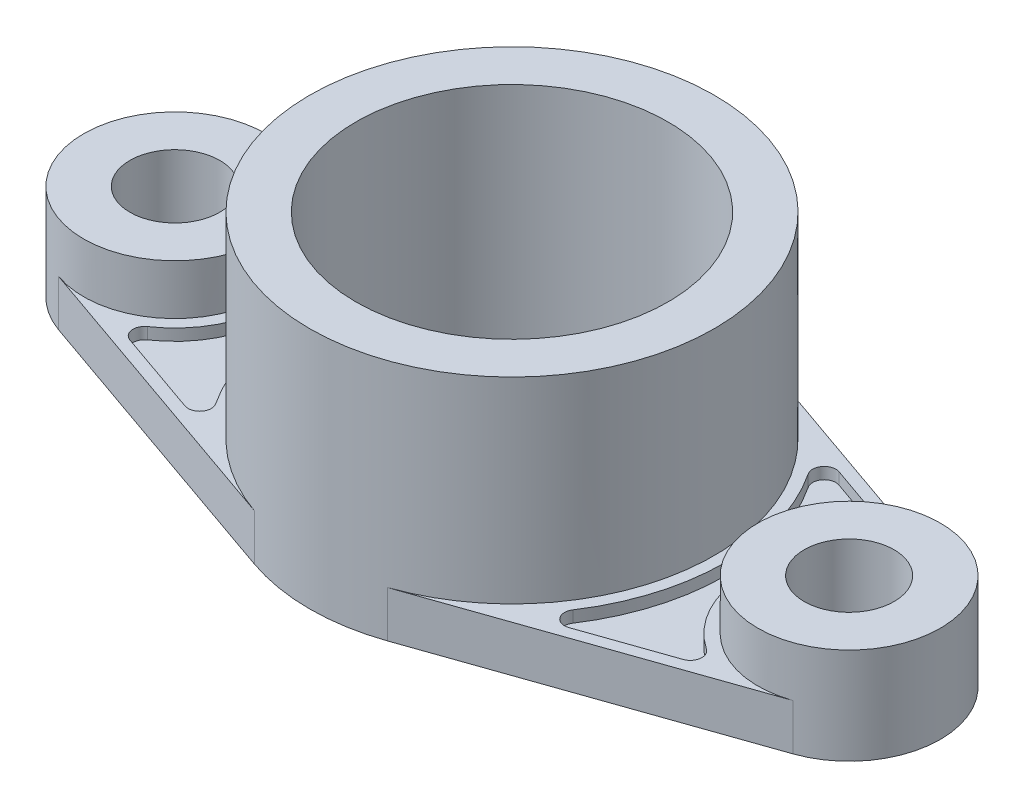
ISO-10303-21;
HEADER;
FILE_DESCRIPTION(('STEP AP214'),'2;1');
FILE_NAME('part.step','',(''),(''),'','','');
FILE_SCHEMA(('AUTOMOTIVE_DESIGN { 1 0 10303 214 1 1 1 1 }'));
ENDSEC;
DATA;
#1=APPLICATION_CONTEXT('core data for automotive mechanical design processes');
#2=APPLICATION_PROTOCOL_DEFINITION('international standard','automotive_design',2000,#1);
#3=PRODUCT_CONTEXT('',#1,'mechanical');
#4=PRODUCT('Part','Part','',(#3));
#5=PRODUCT_RELATED_PRODUCT_CATEGORY('part','',(#4));
#6=PRODUCT_DEFINITION_FORMATION('','',#4);
#7=PRODUCT_DEFINITION_CONTEXT('part definition',#1,'design');
#8=PRODUCT_DEFINITION('design','',#6,#7);
#9=PRODUCT_DEFINITION_SHAPE('','',#8);
#10=(LENGTH_UNIT() NAMED_UNIT(*) SI_UNIT(.MILLI.,.METRE.));
#11=(NAMED_UNIT(*) PLANE_ANGLE_UNIT() SI_UNIT($,.RADIAN.));
#12=(NAMED_UNIT(*) SI_UNIT($,.STERADIAN.) SOLID_ANGLE_UNIT());
#13=UNCERTAINTY_MEASURE_WITH_UNIT(LENGTH_MEASURE(1.E-05),#10,'distance_accuracy_value','');
#14=(GEOMETRIC_REPRESENTATION_CONTEXT(3) GLOBAL_UNCERTAINTY_ASSIGNED_CONTEXT((#13)) GLOBAL_UNIT_ASSIGNED_CONTEXT((#10,
#11,#12)) REPRESENTATION_CONTEXT('',''));
#15=CARTESIAN_POINT('',(0.,0.,0.));
#16=DIRECTION('',(0.,0.,1.));
#17=DIRECTION('',(1.,0.,0.));
#18=AXIS2_PLACEMENT_3D('',#15,#16,#17);
#19=CARTESIAN_POINT('',(-87.5,25.,0.));
#20=DIRECTION('',(0.,-1.,0.));
#21=DIRECTION('',(0.,0.,-1.));
#22=AXIS2_PLACEMENT_3D('',#19,#20,#21);
#23=CYLINDRICAL_SURFACE('',#22,23.665);
#24=CARTESIAN_POINT('',(-87.5,25.,0.));
#25=DIRECTION('',(0.,1.,0.));
#26=DIRECTION('',(0.,0.,1.));
#27=AXIS2_PLACEMENT_3D('',#24,#25,#26);
#28=CIRCLE('',#27,23.665);
#29=CARTESIAN_POINT('',(-87.5,25.,23.665));
#30=VERTEX_POINT('',#29);
#31=EDGE_CURVE('E11',#30,#30,#28,.T.);
#32=ORIENTED_EDGE('',*,*,#31,.F.);
#33=EDGE_LOOP('',(#32));
#34=FACE_BOUND('',#33,.T.);
#35=DIRECTION('',(0.,-1.,0.));
#36=VECTOR('',#35,1.);
#37=CARTESIAN_POINT('',(-95.2986317142857,12.,22.343087709288));
#38=LINE('',#37,#36);
#39=CARTESIAN_POINT('',(-95.2986317142857,12.,22.343087709288));
#40=VERTEX_POINT('',#39);
#41=CARTESIAN_POINT('',(-95.2986317142857,0.,22.343087709288));
#42=VERTEX_POINT('',#41);
#43=EDGE_CURVE('E487',#40,#42,#38,.T.);
#44=ORIENTED_EDGE('',*,*,#43,.F.);
#45=CARTESIAN_POINT('',(-87.5,12.,0.));
#46=DIRECTION('',(0.,1.,0.));
#47=DIRECTION('',(0.,0.,1.));
#48=AXIS2_PLACEMENT_3D('',#45,#46,#47);
#49=CIRCLE('',#48,23.665);
#50=CARTESIAN_POINT('',(-95.2986317142857,12.,-22.343087709288));
#51=VERTEX_POINT('',#50);
#52=EDGE_CURVE('E454',#40,#51,#49,.T.);
#53=ORIENTED_EDGE('',*,*,#52,.T.);
#54=DIRECTION('',(0.,-1.,0.));
#55=VECTOR('',#54,1.);
#56=CARTESIAN_POINT('',(-95.2986317142857,12.,-22.343087709288));
#57=LINE('',#56,#55);
#58=CARTESIAN_POINT('',(-95.2986317142857,0.,-22.343087709288));
#59=VERTEX_POINT('',#58);
#60=EDGE_CURVE('E470',#51,#59,#57,.T.);
#61=ORIENTED_EDGE('',*,*,#60,.T.);
#62=CARTESIAN_POINT('',(-87.5,0.,0.));
#63=DIRECTION('',(0.,1.,0.));
#64=DIRECTION('',(0.,0.,1.));
#65=AXIS2_PLACEMENT_3D('',#62,#63,#64);
#66=CIRCLE('',#65,23.665);
#67=EDGE_CURVE('E49',#59,#42,#66,.T.);
#68=ORIENTED_EDGE('',*,*,#67,.T.);
#69=EDGE_LOOP('',(#44,#53,#61,#68));
#70=FACE_BOUND('',#69,.T.);
#71=ADVANCED_FACE('F45',(#34,#70),#23,.T.);
#72=CARTESIAN_POINT('',(-87.5,25.,0.));
#73=DIRECTION('',(0.,-1.,0.));
#74=DIRECTION('',(0.,0.,-1.));
#75=AXIS2_PLACEMENT_3D('',#72,#73,#74);
#76=CYLINDRICAL_SURFACE('',#75,11.665);
#77=CARTESIAN_POINT('',(-87.5,25.,0.));
#78=DIRECTION('',(0.,1.,0.));
#79=DIRECTION('',(0.,0.,1.));
#80=AXIS2_PLACEMENT_3D('',#77,#78,#79);
#81=CIRCLE('',#80,11.665);
#82=CARTESIAN_POINT('',(-87.5,25.,11.665));
#83=VERTEX_POINT('',#82);
#84=EDGE_CURVE('E55',#83,#83,#81,.T.);
#85=ORIENTED_EDGE('',*,*,#84,.T.);
#86=EDGE_LOOP('',(#85));
#87=FACE_BOUND('',#86,.T.);
#88=CARTESIAN_POINT('',(-87.5,0.,0.));
#89=DIRECTION('',(0.,1.,0.));
#90=DIRECTION('',(0.,0.,1.));
#91=AXIS2_PLACEMENT_3D('',#88,#89,#90);
#92=CIRCLE('',#91,11.665);
#93=CARTESIAN_POINT('',(-87.5,0.,11.665));
#94=VERTEX_POINT('',#93);
#95=EDGE_CURVE('E491',#94,#94,#92,.T.);
#96=ORIENTED_EDGE('',*,*,#95,.F.);
#97=EDGE_LOOP('',(#96));
#98=FACE_BOUND('',#97,.T.);
#99=ADVANCED_FACE('F47',(#87,#98),#76,.F.);
#100=CARTESIAN_POINT('',(0.,25.,0.));
#101=DIRECTION('',(0.,1.,0.));
#102=DIRECTION('',(0.,0.,1.));
#103=AXIS2_PLACEMENT_3D('',#100,#101,#102);
#104=PLANE('',#103);
#105=ORIENTED_EDGE('',*,*,#84,.F.);
#106=EDGE_LOOP('',(#105));
#107=FACE_BOUND('',#106,.T.);
#108=ORIENTED_EDGE('',*,*,#31,.T.);
#109=EDGE_LOOP('',(#108));
#110=FACE_BOUND('',#109,.T.);
#111=ADVANCED_FACE('F556',(#107,#110),#104,.T.);
#112=CARTESIAN_POINT('',(0.,0.,0.));
#113=DIRECTION('',(0.,1.,0.));
#114=DIRECTION('',(0.,0.,1.));
#115=AXIS2_PLACEMENT_3D('',#112,#113,#114);
#116=PLANE('',#115);
#117=ORIENTED_EDGE('',*,*,#95,.T.);
#118=EDGE_LOOP('',(#117));
#119=FACE_BOUND('',#118,.T.);
#120=ORIENTED_EDGE('',*,*,#67,.F.);
#121=DIRECTION('',(0.944140617337334,0.,-0.329542857142857));
#122=VECTOR('',#121,1.);
#123=CARTESIAN_POINT('',(-17.301,0.,-49.5673824102101));
#124=LINE('',#123,#122);
#125=CARTESIAN_POINT('',(-17.301,0.,-49.5673824102101));
#126=VERTEX_POINT('',#125);
#127=EDGE_CURVE('E458',#59,#126,#124,.T.);
#128=ORIENTED_EDGE('',*,*,#127,.T.);
#129=CARTESIAN_POINT('',(0.,0.,0.));
#130=DIRECTION('',(0.,1.,0.));
#131=DIRECTION('',(0.,0.,1.));
#132=AXIS2_PLACEMENT_3D('',#129,#130,#131);
#133=CIRCLE('',#132,52.5);
#134=CARTESIAN_POINT('',(17.301,0.,-49.5673824102101));
#135=VERTEX_POINT('',#134);
#136=EDGE_CURVE('E450',#135,#126,#133,.T.);
#137=ORIENTED_EDGE('',*,*,#136,.F.);
#138=DIRECTION('',(-0.944140617337334,0.,-0.329542857142857));
#139=VECTOR('',#138,1.);
#140=CARTESIAN_POINT('',(17.301,0.,-49.5673824102101));
#141=LINE('',#140,#139);
#142=CARTESIAN_POINT('',(95.2986317142857,0.,-22.343087709288));
#143=VERTEX_POINT('',#142);
#144=EDGE_CURVE('E364',#143,#135,#141,.T.);
#145=ORIENTED_EDGE('',*,*,#144,.F.);
#146=CARTESIAN_POINT('',(87.5,0.,0.));
#147=DIRECTION('',(0.,1.,0.));
#148=DIRECTION('',(0.,0.,1.));
#149=AXIS2_PLACEMENT_3D('',#146,#147,#148);
#150=CIRCLE('',#149,23.665);
#151=CARTESIAN_POINT('',(95.2986317142857,0.,22.343087709288));
#152=VERTEX_POINT('',#151);
#153=EDGE_CURVE('E427',#152,#143,#150,.T.);
#154=ORIENTED_EDGE('',*,*,#153,.F.);
#155=DIRECTION('',(-0.944140617337334,0.,0.329542857142857));
#156=VECTOR('',#155,1.);
#157=CARTESIAN_POINT('',(17.301,0.,49.56738241021));
#158=LINE('',#157,#156);
#159=CARTESIAN_POINT('',(17.301,0.,49.56738241021));
#160=VERTEX_POINT('',#159);
#161=EDGE_CURVE('E389',#152,#160,#158,.T.);
#162=ORIENTED_EDGE('',*,*,#161,.T.);
#163=CARTESIAN_POINT('',(-17.301,0.,49.56738241021));
#164=VERTEX_POINT('',#163);
#165=EDGE_CURVE('E442',#164,#160,#133,.T.);
#166=ORIENTED_EDGE('',*,*,#165,.F.);
#167=DIRECTION('',(0.944140617337334,0.,0.329542857142857));
#168=VECTOR('',#167,1.);
#169=CARTESIAN_POINT('',(-17.301,0.,49.56738241021));
#170=LINE('',#169,#168);
#171=EDGE_CURVE('E446',#42,#164,#170,.T.);
#172=ORIENTED_EDGE('',*,*,#171,.F.);
#173=EDGE_LOOP('',(#120,#128,#137,#145,#154,#162,#166,#172));
#174=FACE_BOUND('',#173,.T.);
#175=CARTESIAN_POINT('',(0.,0.,0.));
#176=DIRECTION('',(0.,1.,0.));
#177=DIRECTION('',(0.,0.,1.));
#178=AXIS2_PLACEMENT_3D('',#175,#176,#177);
#179=CIRCLE('',#178,40.5);
#180=CARTESIAN_POINT('',(0.,0.,40.5));
#181=VERTEX_POINT('',#180);
#182=EDGE_CURVE('E431',#181,#181,#179,.T.);
#183=ORIENTED_EDGE('',*,*,#182,.T.);
#184=EDGE_LOOP('',(#183));
#185=FACE_BOUND('',#184,.T.);
#186=CARTESIAN_POINT('',(87.5,0.,0.));
#187=DIRECTION('',(0.,1.,0.));
#188=DIRECTION('',(0.,0.,1.));
#189=AXIS2_PLACEMENT_3D('',#186,#187,#188);
#190=CIRCLE('',#189,11.665);
#191=CARTESIAN_POINT('',(87.5,0.,11.665));
#192=VERTEX_POINT('',#191);
#193=EDGE_CURVE('E421',#192,#192,#190,.T.);
#194=ORIENTED_EDGE('',*,*,#193,.T.);
#195=EDGE_LOOP('',(#194));
#196=FACE_BOUND('',#195,.T.);
#197=ADVANCED_FACE('F509',(#119,#174,#185,#196),#116,.F.);
#198=CARTESIAN_POINT('',(-17.301,12.,49.56738241021));
#199=DIRECTION('',(0.329542857142857,0.,-0.944140617337334));
#200=DIRECTION('',(-0.944140617337334,0.,-0.329542857142857));
#201=AXIS2_PLACEMENT_3D('',#198,#199,#200);
#202=PLANE('',#201);
#203=ORIENTED_EDGE('',*,*,#171,.T.);
#204=DIRECTION('',(0.,-1.,0.));
#205=VECTOR('',#204,1.);
#206=CARTESIAN_POINT('',(-17.301,12.,49.56738241021));
#207=LINE('',#206,#205);
#208=CARTESIAN_POINT('',(-17.301,12.,49.56738241021));
#209=VERTEX_POINT('',#208);
#210=EDGE_CURVE('E483',#209,#164,#207,.T.);
#211=ORIENTED_EDGE('',*,*,#210,.F.);
#212=DIRECTION('',(0.944140617337334,0.,0.329542857142857));
#213=VECTOR('',#212,1.);
#214=CARTESIAN_POINT('',(-17.301,12.,49.56738241021));
#215=LINE('',#214,#213);
#216=EDGE_CURVE('E457',#40,#209,#215,.T.);
#217=ORIENTED_EDGE('',*,*,#216,.F.);
#218=ORIENTED_EDGE('',*,*,#43,.T.);
#219=EDGE_LOOP('',(#203,#211,#217,#218));
#220=FACE_BOUND('',#219,.T.);
#221=ADVANCED_FACE('F506',(#220),#202,.F.);
#222=CARTESIAN_POINT('',(-17.301,12.,-49.5673824102101));
#223=DIRECTION('',(-0.329542857142857,0.,-0.944140617337334));
#224=DIRECTION('',(-0.944140617337334,0.,0.329542857142857));
#225=AXIS2_PLACEMENT_3D('',#222,#223,#224);
#226=PLANE('',#225);
#227=ORIENTED_EDGE('',*,*,#127,.F.);
#228=ORIENTED_EDGE('',*,*,#60,.F.);
#229=DIRECTION('',(0.944140617337334,0.,-0.329542857142857));
#230=VECTOR('',#229,1.);
#231=CARTESIAN_POINT('',(-17.301,12.,-49.5673824102101));
#232=LINE('',#231,#230);
#233=CARTESIAN_POINT('',(-17.301,12.,-49.5673824102101));
#234=VERTEX_POINT('',#233);
#235=EDGE_CURVE('E466',#51,#234,#232,.T.);
#236=ORIENTED_EDGE('',*,*,#235,.T.);
#237=DIRECTION('',(0.,-1.,0.));
#238=VECTOR('',#237,1.);
#239=CARTESIAN_POINT('',(-17.301,12.,-49.5673824102101));
#240=LINE('',#239,#238);
#241=EDGE_CURVE('E479',#234,#126,#240,.T.);
#242=ORIENTED_EDGE('',*,*,#241,.T.);
#243=EDGE_LOOP('',(#227,#228,#236,#242));
#244=FACE_BOUND('',#243,.T.);
#245=ADVANCED_FACE('F521',(#244),#226,.T.);
#246=CARTESIAN_POINT('',(0.,12.,0.));
#247=DIRECTION('',(0.,1.,0.));
#248=DIRECTION('',(0.,0.,1.));
#249=AXIS2_PLACEMENT_3D('',#246,#247,#248);
#250=PLANE('',#249);
#251=CARTESIAN_POINT('',(-48.8374101689384,12.,-32.2049276973396));
#252=DIRECTION('',(0.,1.,0.));
#253=DIRECTION('',(0.,0.,1.));
#254=AXIS2_PLACEMENT_3D('',#251,#252,#253);
#255=CIRCLE('',#254,3.);
#256=CARTESIAN_POINT('',(-46.3329275961723,12.,-30.5533929436299));
#257=VERTEX_POINT('',#256);
#258=CARTESIAN_POINT('',(-49.826038740367,12.,-35.0373495493516));
#259=VERTEX_POINT('',#258);
#260=EDGE_CURVE('E71',#257,#259,#255,.T.);
#261=ORIENTED_EDGE('',*,*,#260,.F.);
#262=CARTESIAN_POINT('',(0.,12.,0.));
#263=DIRECTION('',(0.,1.,0.));
#264=DIRECTION('',(0.,0.,1.));
#265=AXIS2_PLACEMENT_3D('',#262,#263,#264);
#266=CIRCLE('',#265,55.5);
#267=CARTESIAN_POINT('',(-46.3329275961724,12.,30.5533929436298));
#268=VERTEX_POINT('',#267);
#269=EDGE_CURVE('E307',#257,#268,#266,.T.);
#270=ORIENTED_EDGE('',*,*,#269,.T.);
#271=CARTESIAN_POINT('',(-48.8374101689384,12.,32.2049276973396));
#272=DIRECTION('',(0.,1.,0.));
#273=DIRECTION('',(0.,0.,1.));
#274=AXIS2_PLACEMENT_3D('',#271,#272,#273);
#275=CIRCLE('',#274,3.);
#276=CARTESIAN_POINT('',(-49.826038740367,12.,35.0373495493516));
#277=VERTEX_POINT('',#276);
#278=EDGE_CURVE('E354',#277,#268,#275,.T.);
#279=ORIENTED_EDGE('',*,*,#278,.F.);
#280=DIRECTION('',(0.944140617337334,0.,0.329542857142857));
#281=VECTOR('',#280,1.);
#282=CARTESIAN_POINT('',(-71.8093276206941,12.,27.3643020244494));
#283=LINE('',#282,#281);
#284=CARTESIAN_POINT('',(-71.8093276206941,12.,27.3643020244494));
#285=VERTEX_POINT('',#284);
#286=EDGE_CURVE('E350',#285,#277,#283,.T.);
#287=ORIENTED_EDGE('',*,*,#286,.F.);
#288=CARTESIAN_POINT('',(-70.8206990492656,12.,24.5318801724374));
#289=DIRECTION('',(0.,-1.,0.));
#290=DIRECTION('',(0.,0.,-1.));
#291=AXIS2_PLACEMENT_3D('',#288,#289,#290);
#292=CIRCLE('',#291,3.);
#293=CARTESIAN_POINT('',(-72.507464694039,12.,22.0509888689717));
#294=VERTEX_POINT('',#293);
#295=EDGE_CURVE('E346',#285,#294,#292,.T.);
#296=ORIENTED_EDGE('',*,*,#295,.T.);
#297=CARTESIAN_POINT('',(-87.5,12.,0.));
#298=DIRECTION('',(0.,1.,0.));
#299=DIRECTION('',(0.,0.,1.));
#300=AXIS2_PLACEMENT_3D('',#297,#298,#299);
#301=CIRCLE('',#300,26.665);
#302=CARTESIAN_POINT('',(-72.507464694039,12.,-22.0509888689717));
#303=VERTEX_POINT('',#302);
#304=EDGE_CURVE('E342',#294,#303,#301,.T.);
#305=ORIENTED_EDGE('',*,*,#304,.T.);
#306=CARTESIAN_POINT('',(-70.8206990492656,12.,-24.5318801724374));
#307=DIRECTION('',(0.,-1.,0.));
#308=DIRECTION('',(0.,0.,-1.));
#309=AXIS2_PLACEMENT_3D('',#306,#307,#308);
#310=CIRCLE('',#309,3.);
#311=CARTESIAN_POINT('',(-71.8093276206941,12.,-27.3643020244494));
#312=VERTEX_POINT('',#311);
#313=EDGE_CURVE('E338',#303,#312,#310,.T.);
#314=ORIENTED_EDGE('',*,*,#313,.T.);
#315=DIRECTION('',(-0.944140617337334,0.,0.329542857142857));
#316=VECTOR('',#315,1.);
#317=CARTESIAN_POINT('',(-49.826038740367,12.,-35.0373495493516));
#318=LINE('',#317,#316);
#319=EDGE_CURVE('E334',#259,#312,#318,.T.);
#320=ORIENTED_EDGE('',*,*,#319,.F.);
#321=EDGE_LOOP('',(#261,#270,#279,#287,#296,#305,#314,#320));
#322=FACE_BOUND('',#321,.T.);
#323=ORIENTED_EDGE('',*,*,#52,.F.);
#324=ORIENTED_EDGE('',*,*,#216,.T.);
#325=CARTESIAN_POINT('',(0.,12.,0.));
#326=DIRECTION('',(0.,1.,0.));
#327=DIRECTION('',(0.,0.,1.));
#328=AXIS2_PLACEMENT_3D('',#325,#326,#327);
#329=CIRCLE('',#328,52.5);
#330=EDGE_CURVE('E462',#234,#209,#329,.T.);
#331=ORIENTED_EDGE('',*,*,#330,.F.);
#332=ORIENTED_EDGE('',*,*,#235,.F.);
#333=EDGE_LOOP('',(#323,#324,#331,#332));
#334=FACE_BOUND('',#333,.T.);
#335=ADVANCED_FACE('F518',(#322,#334),#250,.T.);
#336=CARTESIAN_POINT('',(0.,63.,0.));
#337=DIRECTION('',(0.,-1.,0.));
#338=DIRECTION('',(0.,0.,-1.));
#339=AXIS2_PLACEMENT_3D('',#336,#337,#338);
#340=CYLINDRICAL_SURFACE('',#339,40.5);
#341=CARTESIAN_POINT('',(0.,63.,0.));
#342=DIRECTION('',(0.,1.,0.));
#343=DIRECTION('',(0.,0.,1.));
#344=AXIS2_PLACEMENT_3D('',#341,#342,#343);
#345=CIRCLE('',#344,40.5);
#346=CARTESIAN_POINT('',(0.,63.,40.5));
#347=VERTEX_POINT('',#346);
#348=EDGE_CURVE('E437',#347,#347,#345,.T.);
#349=ORIENTED_EDGE('',*,*,#348,.T.);
#350=EDGE_LOOP('',(#349));
#351=FACE_BOUND('',#350,.T.);
#352=ORIENTED_EDGE('',*,*,#182,.F.);
#353=EDGE_LOOP('',(#352));
#354=FACE_BOUND('',#353,.T.);
#355=ADVANCED_FACE('F568',(#351,#354),#340,.F.);
#356=CARTESIAN_POINT('',(0.,63.,0.));
#357=DIRECTION('',(0.,-1.,0.));
#358=DIRECTION('',(0.,0.,-1.));
#359=AXIS2_PLACEMENT_3D('',#356,#357,#358);
#360=CYLINDRICAL_SURFACE('',#359,52.5);
#361=CARTESIAN_POINT('',(0.,12.,0.));
#362=DIRECTION('',(0.,1.,0.));
#363=DIRECTION('',(0.,0.,1.));
#364=AXIS2_PLACEMENT_3D('',#361,#362,#363);
#365=CIRCLE('',#364,52.5);
#366=CARTESIAN_POINT('',(17.301,12.,49.56738241021));
#367=VERTEX_POINT('',#366);
#368=CARTESIAN_POINT('',(17.301,12.,-49.5673824102101));
#369=VERTEX_POINT('',#368);
#370=EDGE_CURVE('E393',#367,#369,#365,.T.);
#371=ORIENTED_EDGE('',*,*,#370,.T.);
#372=DIRECTION('',(0.,-1.,0.));
#373=VECTOR('',#372,1.);
#374=CARTESIAN_POINT('',(17.301,12.,-49.5673824102101));
#375=LINE('',#374,#373);
#376=EDGE_CURVE('E413',#369,#135,#375,.T.);
#377=ORIENTED_EDGE('',*,*,#376,.T.);
#378=ORIENTED_EDGE('',*,*,#136,.T.);
#379=ORIENTED_EDGE('',*,*,#241,.F.);
#380=ORIENTED_EDGE('',*,*,#330,.T.);
#381=ORIENTED_EDGE('',*,*,#210,.T.);
#382=ORIENTED_EDGE('',*,*,#165,.T.);
#383=DIRECTION('',(0.,-1.,0.));
#384=VECTOR('',#383,1.);
#385=CARTESIAN_POINT('',(17.301,12.,49.56738241021));
#386=LINE('',#385,#384);
#387=EDGE_CURVE('E410',#367,#160,#386,.T.);
#388=ORIENTED_EDGE('',*,*,#387,.F.);
#389=EDGE_LOOP('',(#371,#377,#378,#379,#380,#381,#382,#388));
#390=FACE_BOUND('',#389,.T.);
#391=CARTESIAN_POINT('',(0.,63.,0.));
#392=DIRECTION('',(0.,1.,0.));
#393=DIRECTION('',(0.,0.,1.));
#394=AXIS2_PLACEMENT_3D('',#391,#392,#393);
#395=CIRCLE('',#394,52.5);
#396=CARTESIAN_POINT('',(0.,63.,52.5));
#397=VERTEX_POINT('',#396);
#398=EDGE_CURVE('E441',#397,#397,#395,.T.);
#399=ORIENTED_EDGE('',*,*,#398,.F.);
#400=EDGE_LOOP('',(#399));
#401=FACE_BOUND('',#400,.T.);
#402=ADVANCED_FACE('F514',(#390,#401),#360,.T.);
#403=CARTESIAN_POINT('',(0.,63.,0.));
#404=DIRECTION('',(0.,1.,0.));
#405=DIRECTION('',(0.,0.,1.));
#406=AXIS2_PLACEMENT_3D('',#403,#404,#405);
#407=PLANE('',#406);
#408=ORIENTED_EDGE('',*,*,#348,.F.);
#409=EDGE_LOOP('',(#408));
#410=FACE_BOUND('',#409,.T.);
#411=ORIENTED_EDGE('',*,*,#398,.T.);
#412=EDGE_LOOP('',(#411));
#413=FACE_BOUND('',#412,.T.);
#414=ADVANCED_FACE('F575',(#410,#413),#407,.T.);
#415=CARTESIAN_POINT('',(87.5,25.,0.));
#416=DIRECTION('',(0.,-1.,0.));
#417=DIRECTION('',(0.,0.,-1.));
#418=AXIS2_PLACEMENT_3D('',#415,#416,#417);
#419=CYLINDRICAL_SURFACE('',#418,23.665);
#420=CARTESIAN_POINT('',(87.5,25.,0.));
#421=DIRECTION('',(0.,1.,0.));
#422=DIRECTION('',(0.,0.,1.));
#423=AXIS2_PLACEMENT_3D('',#420,#421,#422);
#424=CIRCLE('',#423,23.665);
#425=CARTESIAN_POINT('',(87.5,25.,23.665));
#426=VERTEX_POINT('',#425);
#427=EDGE_CURVE('E426',#426,#426,#424,.T.);
#428=ORIENTED_EDGE('',*,*,#427,.F.);
#429=EDGE_LOOP('',(#428));
#430=FACE_BOUND('',#429,.T.);
#431=DIRECTION('',(0.,-1.,0.));
#432=VECTOR('',#431,1.);
#433=CARTESIAN_POINT('',(95.2986317142857,12.,-22.343087709288));
#434=LINE('',#433,#432);
#435=CARTESIAN_POINT('',(95.2986317142857,12.,-22.343087709288));
#436=VERTEX_POINT('',#435);
#437=EDGE_CURVE('E417',#436,#143,#434,.T.);
#438=ORIENTED_EDGE('',*,*,#437,.F.);
#439=CARTESIAN_POINT('',(87.5,12.,0.));
#440=DIRECTION('',(0.,1.,0.));
#441=DIRECTION('',(0.,0.,1.));
#442=AXIS2_PLACEMENT_3D('',#439,#440,#441);
#443=CIRCLE('',#442,23.665);
#444=CARTESIAN_POINT('',(95.2986317142857,12.,22.343087709288));
#445=VERTEX_POINT('',#444);
#446=EDGE_CURVE('E385',#436,#445,#443,.T.);
#447=ORIENTED_EDGE('',*,*,#446,.T.);
#448=DIRECTION('',(0.,-1.,0.));
#449=VECTOR('',#448,1.);
#450=CARTESIAN_POINT('',(95.2986317142857,12.,22.343087709288));
#451=LINE('',#450,#449);
#452=EDGE_CURVE('E401',#445,#152,#451,.T.);
#453=ORIENTED_EDGE('',*,*,#452,.T.);
#454=ORIENTED_EDGE('',*,*,#153,.T.);
#455=EDGE_LOOP('',(#438,#447,#453,#454));
#456=FACE_BOUND('',#455,.T.);
#457=ADVANCED_FACE('F534',(#430,#456),#419,.T.);
#458=CARTESIAN_POINT('',(87.5,25.,0.));
#459=DIRECTION('',(0.,-1.,0.));
#460=DIRECTION('',(0.,0.,-1.));
#461=AXIS2_PLACEMENT_3D('',#458,#459,#460);
#462=CYLINDRICAL_SURFACE('',#461,11.665);
#463=CARTESIAN_POINT('',(87.5,25.,0.));
#464=DIRECTION('',(0.,1.,0.));
#465=DIRECTION('',(0.,0.,1.));
#466=AXIS2_PLACEMENT_3D('',#463,#464,#465);
#467=CIRCLE('',#466,11.665);
#468=CARTESIAN_POINT('',(87.5,25.,11.665));
#469=VERTEX_POINT('',#468);
#470=EDGE_CURVE('E422',#469,#469,#467,.T.);
#471=ORIENTED_EDGE('',*,*,#470,.T.);
#472=EDGE_LOOP('',(#471));
#473=FACE_BOUND('',#472,.T.);
#474=ORIENTED_EDGE('',*,*,#193,.F.);
#475=EDGE_LOOP('',(#474));
#476=FACE_BOUND('',#475,.T.);
#477=ADVANCED_FACE('F579',(#473,#476),#462,.F.);
#478=CARTESIAN_POINT('',(0.,25.,0.));
#479=DIRECTION('',(0.,1.,0.));
#480=DIRECTION('',(0.,0.,1.));
#481=AXIS2_PLACEMENT_3D('',#478,#479,#480);
#482=PLANE('',#481);
#483=ORIENTED_EDGE('',*,*,#470,.F.);
#484=EDGE_LOOP('',(#483));
#485=FACE_BOUND('',#484,.T.);
#486=ORIENTED_EDGE('',*,*,#427,.T.);
#487=EDGE_LOOP('',(#486));
#488=FACE_BOUND('',#487,.T.);
#489=ADVANCED_FACE('F547',(#485,#488),#482,.T.);
#490=CARTESIAN_POINT('',(17.301,12.,-49.5673824102101));
#491=DIRECTION('',(-0.329542857142857,0.,0.944140617337334));
#492=DIRECTION('',(0.944140617337334,0.,0.329542857142857));
#493=AXIS2_PLACEMENT_3D('',#490,#491,#492);
#494=PLANE('',#493);
#495=ORIENTED_EDGE('',*,*,#144,.T.);
#496=ORIENTED_EDGE('',*,*,#376,.F.);
#497=DIRECTION('',(-0.944140617337334,0.,-0.329542857142857));
#498=VECTOR('',#497,1.);
#499=CARTESIAN_POINT('',(17.301,12.,-49.5673824102101));
#500=LINE('',#499,#498);
#501=EDGE_CURVE('E388',#436,#369,#500,.T.);
#502=ORIENTED_EDGE('',*,*,#501,.F.);
#503=ORIENTED_EDGE('',*,*,#437,.T.);
#504=EDGE_LOOP('',(#495,#496,#502,#503));
#505=FACE_BOUND('',#504,.T.);
#506=ADVANCED_FACE('F527',(#505),#494,.F.);
#507=CARTESIAN_POINT('',(17.301,12.,49.56738241021));
#508=DIRECTION('',(0.329542857142857,0.,0.944140617337334));
#509=DIRECTION('',(0.944140617337334,0.,-0.329542857142857));
#510=AXIS2_PLACEMENT_3D('',#507,#508,#509);
#511=PLANE('',#510);
#512=ORIENTED_EDGE('',*,*,#161,.F.);
#513=ORIENTED_EDGE('',*,*,#452,.F.);
#514=DIRECTION('',(-0.944140617337334,0.,0.329542857142857));
#515=VECTOR('',#514,1.);
#516=CARTESIAN_POINT('',(17.301,12.,49.56738241021));
#517=LINE('',#516,#515);
#518=EDGE_CURVE('E397',#445,#367,#517,.T.);
#519=ORIENTED_EDGE('',*,*,#518,.T.);
#520=ORIENTED_EDGE('',*,*,#387,.T.);
#521=EDGE_LOOP('',(#512,#513,#519,#520));
#522=FACE_BOUND('',#521,.T.);
#523=ADVANCED_FACE('F536',(#522),#511,.T.);
#524=CARTESIAN_POINT('',(0.,12.,0.));
#525=DIRECTION('',(0.,1.,0.));
#526=DIRECTION('',(0.,0.,1.));
#527=AXIS2_PLACEMENT_3D('',#524,#525,#526);
#528=PLANE('',#527);
#529=CARTESIAN_POINT('',(0.,12.,0.));
#530=DIRECTION('',(0.,-1.,0.));
#531=DIRECTION('',(0.,0.,1.));
#532=AXIS2_PLACEMENT_3D('',#529,#530,#531);
#533=CIRCLE('',#532,55.5);
#534=CARTESIAN_POINT('',(46.3329275961723,12.,-30.5533929436299));
#535=VERTEX_POINT('',#534);
#536=CARTESIAN_POINT('',(46.3329275961724,12.,30.5533929436298));
#537=VERTEX_POINT('',#536);
#538=EDGE_CURVE('E256',#535,#537,#533,.T.);
#539=ORIENTED_EDGE('',*,*,#538,.F.);
#540=CARTESIAN_POINT('',(48.8374101689384,12.,-32.2049276973396));
#541=DIRECTION('',(0.,-1.,0.));
#542=DIRECTION('',(0.,0.,1.));
#543=AXIS2_PLACEMENT_3D('',#540,#541,#542);
#544=CIRCLE('',#543,3.);
#545=CARTESIAN_POINT('',(49.826038740367,12.,-35.0373495493516));
#546=VERTEX_POINT('',#545);
#547=EDGE_CURVE('E63',#535,#546,#544,.T.);
#548=ORIENTED_EDGE('',*,*,#547,.T.);
#549=DIRECTION('',(0.944140617337334,0.,0.329542857142857));
#550=VECTOR('',#549,1.);
#551=CARTESIAN_POINT('',(49.826038740367,12.,-35.0373495493516));
#552=LINE('',#551,#550);
#553=CARTESIAN_POINT('',(71.8093276206941,12.,-27.3643020244494));
#554=VERTEX_POINT('',#553);
#555=EDGE_CURVE('E228',#546,#554,#552,.T.);
#556=ORIENTED_EDGE('',*,*,#555,.T.);
#557=CARTESIAN_POINT('',(70.8206990492656,12.,-24.5318801724374));
#558=DIRECTION('',(0.,1.,0.));
#559=DIRECTION('',(0.,0.,-1.));
#560=AXIS2_PLACEMENT_3D('',#557,#558,#559);
#561=CIRCLE('',#560,3.);
#562=CARTESIAN_POINT('',(72.507464694039,12.,-22.0509888689717));
#563=VERTEX_POINT('',#562);
#564=EDGE_CURVE('E275',#563,#554,#561,.T.);
#565=ORIENTED_EDGE('',*,*,#564,.F.);
#566=CARTESIAN_POINT('',(87.5,12.,0.));
#567=DIRECTION('',(0.,-1.,0.));
#568=DIRECTION('',(0.,0.,1.));
#569=AXIS2_PLACEMENT_3D('',#566,#567,#568);
#570=CIRCLE('',#569,26.665);
#571=CARTESIAN_POINT('',(72.507464694039,12.,22.0509888689717));
#572=VERTEX_POINT('',#571);
#573=EDGE_CURVE('E271',#572,#563,#570,.T.);
#574=ORIENTED_EDGE('',*,*,#573,.F.);
#575=CARTESIAN_POINT('',(70.8206990492656,12.,24.5318801724374));
#576=DIRECTION('',(0.,1.,0.));
#577=DIRECTION('',(0.,0.,-1.));
#578=AXIS2_PLACEMENT_3D('',#575,#576,#577);
#579=CIRCLE('',#578,3.);
#580=CARTESIAN_POINT('',(71.8093276206941,12.,27.3643020244494));
#581=VERTEX_POINT('',#580);
#582=EDGE_CURVE('E267',#581,#572,#579,.T.);
#583=ORIENTED_EDGE('',*,*,#582,.F.);
#584=DIRECTION('',(-0.944140617337334,0.,0.329542857142857));
#585=VECTOR('',#584,1.);
#586=CARTESIAN_POINT('',(71.8093276206941,12.,27.3643020244494));
#587=LINE('',#586,#585);
#588=CARTESIAN_POINT('',(49.826038740367,12.,35.0373495493516));
#589=VERTEX_POINT('',#588);
#590=EDGE_CURVE('E263',#581,#589,#587,.T.);
#591=ORIENTED_EDGE('',*,*,#590,.T.);
#592=CARTESIAN_POINT('',(48.8374101689384,12.,32.2049276973396));
#593=DIRECTION('',(0.,-1.,0.));
#594=DIRECTION('',(0.,0.,1.));
#595=AXIS2_PLACEMENT_3D('',#592,#593,#594);
#596=CIRCLE('',#595,3.);
#597=EDGE_CURVE('E259',#589,#537,#596,.T.);
#598=ORIENTED_EDGE('',*,*,#597,.T.);
#599=EDGE_LOOP('',(#539,#548,#556,#565,#574,#583,#591,#598));
#600=FACE_BOUND('',#599,.T.);
#601=ORIENTED_EDGE('',*,*,#446,.F.);
#602=ORIENTED_EDGE('',*,*,#501,.T.);
#603=ORIENTED_EDGE('',*,*,#370,.F.);
#604=ORIENTED_EDGE('',*,*,#518,.F.);
#605=EDGE_LOOP('',(#601,#602,#603,#604));
#606=FACE_BOUND('',#605,.T.);
#607=ADVANCED_FACE('F530',(#600,#606),#528,.T.);
#608=CARTESIAN_POINT('',(-48.8374101689384,9.,-32.2049276973396));
#609=DIRECTION('',(0.,1.,0.));
#610=DIRECTION('',(0.,0.,1.));
#611=AXIS2_PLACEMENT_3D('',#608,#609,#610);
#612=CYLINDRICAL_SURFACE('',#611,3.);
#613=ORIENTED_EDGE('',*,*,#260,.T.);
#614=DIRECTION('',(0.,1.,0.));
#615=VECTOR('',#614,1.);
#616=CARTESIAN_POINT('',(-49.826038740367,9.,-35.0373495493516));
#617=LINE('',#616,#615);
#618=CARTESIAN_POINT('',(-49.826038740367,9.,-35.0373495493516));
#619=VERTEX_POINT('',#618);
#620=EDGE_CURVE('E331',#619,#259,#617,.T.);
#621=ORIENTED_EDGE('',*,*,#620,.F.);
#622=CARTESIAN_POINT('',(-48.8374101689384,9.,-32.2049276973396));
#623=DIRECTION('',(0.,1.,0.));
#624=DIRECTION('',(0.,0.,1.));
#625=AXIS2_PLACEMENT_3D('',#622,#623,#624);
#626=CIRCLE('',#625,3.);
#627=CARTESIAN_POINT('',(-46.3329275961723,9.,-30.5533929436299));
#628=VERTEX_POINT('',#627);
#629=EDGE_CURVE('E302',#628,#619,#626,.T.);
#630=ORIENTED_EDGE('',*,*,#629,.F.);
#631=DIRECTION('',(0.,1.,0.));
#632=VECTOR('',#631,1.);
#633=CARTESIAN_POINT('',(-46.3329275961723,9.,-30.5533929436299));
#634=LINE('',#633,#632);
#635=EDGE_CURVE('E361',#628,#257,#634,.T.);
#636=ORIENTED_EDGE('',*,*,#635,.T.);
#637=EDGE_LOOP('',(#613,#621,#630,#636));
#638=FACE_BOUND('',#637,.T.);
#639=ADVANCED_FACE('F544',(#638),#612,.F.);
#640=CARTESIAN_POINT('',(0.,9.,0.));
#641=DIRECTION('',(0.,1.,0.));
#642=DIRECTION('',(0.,0.,1.));
#643=AXIS2_PLACEMENT_3D('',#640,#641,#642);
#644=CYLINDRICAL_SURFACE('',#643,55.5);
#645=ORIENTED_EDGE('',*,*,#269,.F.);
#646=ORIENTED_EDGE('',*,*,#635,.F.);
#647=CARTESIAN_POINT('',(0.,9.,0.));
#648=DIRECTION('',(0.,1.,0.));
#649=DIRECTION('',(0.,0.,1.));
#650=AXIS2_PLACEMENT_3D('',#647,#648,#649);
#651=CIRCLE('',#650,55.5);
#652=CARTESIAN_POINT('',(-46.3329275961724,9.,30.5533929436298));
#653=VERTEX_POINT('',#652);
#654=EDGE_CURVE('E328',#628,#653,#651,.T.);
#655=ORIENTED_EDGE('',*,*,#654,.T.);
#656=DIRECTION('',(0.,1.,0.));
#657=VECTOR('',#656,1.);
#658=CARTESIAN_POINT('',(-46.3329275961724,9.,30.5533929436298));
#659=LINE('',#658,#657);
#660=EDGE_CURVE('E365',#653,#268,#659,.T.);
#661=ORIENTED_EDGE('',*,*,#660,.T.);
#662=EDGE_LOOP('',(#645,#646,#655,#661));
#663=FACE_BOUND('',#662,.T.);
#664=ADVANCED_FACE('F640',(#663),#644,.T.);
#665=CARTESIAN_POINT('',(-48.8374101689384,9.,32.2049276973396));
#666=DIRECTION('',(0.,1.,0.));
#667=DIRECTION('',(0.,0.,1.));
#668=AXIS2_PLACEMENT_3D('',#665,#666,#667);
#669=CYLINDRICAL_SURFACE('',#668,3.);
#670=ORIENTED_EDGE('',*,*,#278,.T.);
#671=ORIENTED_EDGE('',*,*,#660,.F.);
#672=CARTESIAN_POINT('',(-48.8374101689384,9.,32.2049276973396));
#673=DIRECTION('',(0.,1.,0.));
#674=DIRECTION('',(0.,0.,1.));
#675=AXIS2_PLACEMENT_3D('',#672,#673,#674);
#676=CIRCLE('',#675,3.);
#677=CARTESIAN_POINT('',(-49.826038740367,9.,35.0373495493516));
#678=VERTEX_POINT('',#677);
#679=EDGE_CURVE('E324',#678,#653,#676,.T.);
#680=ORIENTED_EDGE('',*,*,#679,.F.);
#681=DIRECTION('',(0.,1.,0.));
#682=VECTOR('',#681,1.);
#683=CARTESIAN_POINT('',(-49.826038740367,9.,35.0373495493516));
#684=LINE('',#683,#682);
#685=EDGE_CURVE('E368',#678,#277,#684,.T.);
#686=ORIENTED_EDGE('',*,*,#685,.T.);
#687=EDGE_LOOP('',(#670,#671,#680,#686));
#688=FACE_BOUND('',#687,.T.);
#689=ADVANCED_FACE('F648',(#688),#669,.F.);
#690=CARTESIAN_POINT('',(-71.8093276206941,9.,27.3643020244494));
#691=DIRECTION('',(-0.329542857142857,0.,0.944140617337334));
#692=DIRECTION('',(0.944140617337334,0.,0.329542857142857));
#693=AXIS2_PLACEMENT_3D('',#690,#691,#692);
#694=PLANE('',#693);
#695=ORIENTED_EDGE('',*,*,#286,.T.);
#696=ORIENTED_EDGE('',*,*,#685,.F.);
#697=DIRECTION('',(0.944140617337334,0.,0.329542857142857));
#698=VECTOR('',#697,1.);
#699=CARTESIAN_POINT('',(-71.8093276206941,9.,27.3643020244494));
#700=LINE('',#699,#698);
#701=CARTESIAN_POINT('',(-71.8093276206941,9.,27.3643020244494));
#702=VERTEX_POINT('',#701);
#703=EDGE_CURVE('E320',#702,#678,#700,.T.);
#704=ORIENTED_EDGE('',*,*,#703,.F.);
#705=DIRECTION('',(0.,1.,0.));
#706=VECTOR('',#705,1.);
#707=CARTESIAN_POINT('',(-71.8093276206941,9.,27.3643020244494));
#708=LINE('',#707,#706);
#709=EDGE_CURVE('E371',#702,#285,#708,.T.);
#710=ORIENTED_EDGE('',*,*,#709,.T.);
#711=EDGE_LOOP('',(#695,#696,#704,#710));
#712=FACE_BOUND('',#711,.T.);
#713=ADVANCED_FACE('F657',(#712),#694,.F.);
#714=CARTESIAN_POINT('',(-70.8206990492656,9.,24.5318801724374));
#715=DIRECTION('',(0.,1.,0.));
#716=DIRECTION('',(0.,0.,1.));
#717=AXIS2_PLACEMENT_3D('',#714,#715,#716);
#718=CYLINDRICAL_SURFACE('',#717,3.);
#719=ORIENTED_EDGE('',*,*,#295,.F.);
#720=ORIENTED_EDGE('',*,*,#709,.F.);
#721=CARTESIAN_POINT('',(-70.8206990492656,9.,24.5318801724374));
#722=DIRECTION('',(0.,-1.,0.));
#723=DIRECTION('',(0.,0.,-1.));
#724=AXIS2_PLACEMENT_3D('',#721,#722,#723);
#725=CIRCLE('',#724,3.);
#726=CARTESIAN_POINT('',(-72.507464694039,9.,22.0509888689717));
#727=VERTEX_POINT('',#726);
#728=EDGE_CURVE('E317',#702,#727,#725,.T.);
#729=ORIENTED_EDGE('',*,*,#728,.T.);
#730=DIRECTION('',(0.,1.,0.));
#731=VECTOR('',#730,1.);
#732=CARTESIAN_POINT('',(-72.507464694039,9.,22.0509888689717));
#733=LINE('',#732,#731);
#734=EDGE_CURVE('E374',#727,#294,#733,.T.);
#735=ORIENTED_EDGE('',*,*,#734,.T.);
#736=EDGE_LOOP('',(#719,#720,#729,#735));
#737=FACE_BOUND('',#736,.T.);
#738=ADVANCED_FACE('F666',(#737),#718,.F.);
#739=CARTESIAN_POINT('',(-87.5,9.,0.));
#740=DIRECTION('',(0.,1.,0.));
#741=DIRECTION('',(0.,0.,1.));
#742=AXIS2_PLACEMENT_3D('',#739,#740,#741);
#743=CYLINDRICAL_SURFACE('',#742,26.665);
#744=ORIENTED_EDGE('',*,*,#304,.F.);
#745=ORIENTED_EDGE('',*,*,#734,.F.);
#746=CARTESIAN_POINT('',(-87.5,9.,0.));
#747=DIRECTION('',(0.,1.,0.));
#748=DIRECTION('',(0.,0.,1.));
#749=AXIS2_PLACEMENT_3D('',#746,#747,#748);
#750=CIRCLE('',#749,26.665);
#751=CARTESIAN_POINT('',(-72.507464694039,9.,-22.0509888689717));
#752=VERTEX_POINT('',#751);
#753=EDGE_CURVE('E314',#727,#752,#750,.T.);
#754=ORIENTED_EDGE('',*,*,#753,.T.);
#755=DIRECTION('',(0.,1.,0.));
#756=VECTOR('',#755,1.);
#757=CARTESIAN_POINT('',(-72.507464694039,9.,-22.0509888689717));
#758=LINE('',#757,#756);
#759=EDGE_CURVE('E377',#752,#303,#758,.T.);
#760=ORIENTED_EDGE('',*,*,#759,.T.);
#761=EDGE_LOOP('',(#744,#745,#754,#760));
#762=FACE_BOUND('',#761,.T.);
#763=ADVANCED_FACE('F675',(#762),#743,.T.);
#764=CARTESIAN_POINT('',(-70.8206990492656,9.,-24.5318801724374));
#765=DIRECTION('',(0.,1.,0.));
#766=DIRECTION('',(0.,0.,1.));
#767=AXIS2_PLACEMENT_3D('',#764,#765,#766);
#768=CYLINDRICAL_SURFACE('',#767,3.);
#769=ORIENTED_EDGE('',*,*,#313,.F.);
#770=ORIENTED_EDGE('',*,*,#759,.F.);
#771=CARTESIAN_POINT('',(-70.8206990492656,9.,-24.5318801724374));
#772=DIRECTION('',(0.,-1.,0.));
#773=DIRECTION('',(0.,0.,-1.));
#774=AXIS2_PLACEMENT_3D('',#771,#772,#773);
#775=CIRCLE('',#774,3.);
#776=CARTESIAN_POINT('',(-71.8093276206941,9.,-27.3643020244494));
#777=VERTEX_POINT('',#776);
#778=EDGE_CURVE('E311',#752,#777,#775,.T.);
#779=ORIENTED_EDGE('',*,*,#778,.T.);
#780=DIRECTION('',(0.,1.,0.));
#781=VECTOR('',#780,1.);
#782=CARTESIAN_POINT('',(-71.8093276206941,9.,-27.3643020244494));
#783=LINE('',#782,#781);
#784=EDGE_CURVE('E380',#777,#312,#783,.T.);
#785=ORIENTED_EDGE('',*,*,#784,.T.);
#786=EDGE_LOOP('',(#769,#770,#779,#785));
#787=FACE_BOUND('',#786,.T.);
#788=ADVANCED_FACE('F684',(#787),#768,.F.);
#789=CARTESIAN_POINT('',(-49.826038740367,9.,-35.0373495493516));
#790=DIRECTION('',(-0.329542857142857,0.,-0.944140617337334));
#791=DIRECTION('',(-0.944140617337334,0.,0.329542857142857));
#792=AXIS2_PLACEMENT_3D('',#789,#790,#791);
#793=PLANE('',#792);
#794=ORIENTED_EDGE('',*,*,#319,.T.);
#795=ORIENTED_EDGE('',*,*,#784,.F.);
#796=DIRECTION('',(-0.944140617337334,0.,0.329542857142857));
#797=VECTOR('',#796,1.);
#798=CARTESIAN_POINT('',(-49.826038740367,9.,-35.0373495493516));
#799=LINE('',#798,#797);
#800=EDGE_CURVE('E306',#619,#777,#799,.T.);
#801=ORIENTED_EDGE('',*,*,#800,.F.);
#802=ORIENTED_EDGE('',*,*,#620,.T.);
#803=EDGE_LOOP('',(#794,#795,#801,#802));
#804=FACE_BOUND('',#803,.T.);
#805=ADVANCED_FACE('F693',(#804),#793,.F.);
#806=CARTESIAN_POINT('',(-48.8374101689384,9.,-32.2049276973396));
#807=DIRECTION('',(0.,1.,0.));
#808=DIRECTION('',(0.,0.,1.));
#809=AXIS2_PLACEMENT_3D('',#806,#807,#808);
#810=PLANE('',#809);
#811=ORIENTED_EDGE('',*,*,#629,.T.);
#812=ORIENTED_EDGE('',*,*,#800,.T.);
#813=ORIENTED_EDGE('',*,*,#778,.F.);
#814=ORIENTED_EDGE('',*,*,#753,.F.);
#815=ORIENTED_EDGE('',*,*,#728,.F.);
#816=ORIENTED_EDGE('',*,*,#703,.T.);
#817=ORIENTED_EDGE('',*,*,#679,.T.);
#818=ORIENTED_EDGE('',*,*,#654,.F.);
#819=EDGE_LOOP('',(#811,#812,#813,#814,#815,#816,#817,#818));
#820=FACE_BOUND('',#819,.T.);
#821=ADVANCED_FACE('F702',(#820),#810,.T.);
#822=CARTESIAN_POINT('',(48.8374101689384,9.,-32.2049276973396));
#823=DIRECTION('',(0.,1.,0.));
#824=DIRECTION('',(0.,0.,1.));
#825=AXIS2_PLACEMENT_3D('',#822,#823,#824);
#826=CYLINDRICAL_SURFACE('',#825,3.);
#827=ORIENTED_EDGE('',*,*,#547,.F.);
#828=DIRECTION('',(0.,1.,0.));
#829=VECTOR('',#828,1.);
#830=CARTESIAN_POINT('',(46.3329275961723,9.,-30.5533929436299));
#831=LINE('',#830,#829);
#832=CARTESIAN_POINT('',(46.3329275961723,9.,-30.5533929436299));
#833=VERTEX_POINT('',#832);
#834=EDGE_CURVE('E208',#833,#535,#831,.T.);
#835=ORIENTED_EDGE('',*,*,#834,.F.);
#836=CARTESIAN_POINT('',(48.8374101689384,9.,-32.2049276973396));
#837=DIRECTION('',(0.,-1.,0.));
#838=DIRECTION('',(0.,0.,1.));
#839=AXIS2_PLACEMENT_3D('',#836,#837,#838);
#840=CIRCLE('',#839,3.);
#841=CARTESIAN_POINT('',(49.826038740367,9.,-35.0373495493516));
#842=VERTEX_POINT('',#841);
#843=EDGE_CURVE('E211',#833,#842,#840,.T.);
#844=ORIENTED_EDGE('',*,*,#843,.T.);
#845=DIRECTION('',(0.,1.,0.));
#846=VECTOR('',#845,1.);
#847=CARTESIAN_POINT('',(49.826038740367,9.,-35.0373495493516));
#848=LINE('',#847,#846);
#849=EDGE_CURVE('E282',#842,#546,#848,.T.);
#850=ORIENTED_EDGE('',*,*,#849,.T.);
#851=EDGE_LOOP('',(#827,#835,#844,#850));
#852=FACE_BOUND('',#851,.T.);
#853=ADVANCED_FACE('F210',(#852),#826,.F.);
#854=CARTESIAN_POINT('',(49.826038740367,9.,-35.0373495493516));
#855=DIRECTION('',(-0.329542857142857,0.,0.944140617337334));
#856=DIRECTION('',(0.944140617337334,0.,0.329542857142857));
#857=AXIS2_PLACEMENT_3D('',#854,#855,#856);
#858=PLANE('',#857);
#859=ORIENTED_EDGE('',*,*,#555,.F.);
#860=ORIENTED_EDGE('',*,*,#849,.F.);
#861=DIRECTION('',(0.944140617337334,0.,0.329542857142857));
#862=VECTOR('',#861,1.);
#863=CARTESIAN_POINT('',(49.826038740367,9.,-35.0373495493516));
#864=LINE('',#863,#862);
#865=CARTESIAN_POINT('',(71.8093276206941,9.,-27.3643020244494));
#866=VERTEX_POINT('',#865);
#867=EDGE_CURVE('E219',#842,#866,#864,.T.);
#868=ORIENTED_EDGE('',*,*,#867,.T.);
#869=DIRECTION('',(0.,1.,0.));
#870=VECTOR('',#869,1.);
#871=CARTESIAN_POINT('',(71.8093276206941,9.,-27.3643020244494));
#872=LINE('',#871,#870);
#873=EDGE_CURVE('E285',#866,#554,#872,.T.);
#874=ORIENTED_EDGE('',*,*,#873,.T.);
#875=EDGE_LOOP('',(#859,#860,#868,#874));
#876=FACE_BOUND('',#875,.T.);
#877=ADVANCED_FACE('F717',(#876),#858,.T.);
#878=CARTESIAN_POINT('',(70.8206990492656,9.,-24.5318801724374));
#879=DIRECTION('',(0.,1.,0.));
#880=DIRECTION('',(0.,0.,1.));
#881=AXIS2_PLACEMENT_3D('',#878,#879,#880);
#882=CYLINDRICAL_SURFACE('',#881,3.);
#883=ORIENTED_EDGE('',*,*,#564,.T.);
#884=ORIENTED_EDGE('',*,*,#873,.F.);
#885=CARTESIAN_POINT('',(70.8206990492656,9.,-24.5318801724374));
#886=DIRECTION('',(0.,1.,0.));
#887=DIRECTION('',(0.,0.,-1.));
#888=AXIS2_PLACEMENT_3D('',#885,#886,#887);
#889=CIRCLE('',#888,3.);
#890=CARTESIAN_POINT('',(72.507464694039,9.,-22.0509888689717));
#891=VERTEX_POINT('',#890);
#892=EDGE_CURVE('E249',#891,#866,#889,.T.);
#893=ORIENTED_EDGE('',*,*,#892,.F.);
#894=DIRECTION('',(0.,1.,0.));
#895=VECTOR('',#894,1.);
#896=CARTESIAN_POINT('',(72.507464694039,9.,-22.0509888689717));
#897=LINE('',#896,#895);
#898=EDGE_CURVE('E288',#891,#563,#897,.T.);
#899=ORIENTED_EDGE('',*,*,#898,.T.);
#900=EDGE_LOOP('',(#883,#884,#893,#899));
#901=FACE_BOUND('',#900,.T.);
#902=ADVANCED_FACE('F725',(#901),#882,.F.);
#903=CARTESIAN_POINT('',(87.5,9.,0.));
#904=DIRECTION('',(0.,1.,0.));
#905=DIRECTION('',(0.,0.,1.));
#906=AXIS2_PLACEMENT_3D('',#903,#904,#905);
#907=CYLINDRICAL_SURFACE('',#906,26.665);
#908=ORIENTED_EDGE('',*,*,#573,.T.);
#909=ORIENTED_EDGE('',*,*,#898,.F.);
#910=CARTESIAN_POINT('',(87.5,9.,0.));
#911=DIRECTION('',(0.,-1.,0.));
#912=DIRECTION('',(0.,0.,1.));
#913=AXIS2_PLACEMENT_3D('',#910,#911,#912);
#914=CIRCLE('',#913,26.665);
#915=CARTESIAN_POINT('',(72.507464694039,9.,22.0509888689717));
#916=VERTEX_POINT('',#915);
#917=EDGE_CURVE('E245',#916,#891,#914,.T.);
#918=ORIENTED_EDGE('',*,*,#917,.F.);
#919=DIRECTION('',(0.,1.,0.));
#920=VECTOR('',#919,1.);
#921=CARTESIAN_POINT('',(72.507464694039,9.,22.0509888689717));
#922=LINE('',#921,#920);
#923=EDGE_CURVE('E291',#916,#572,#922,.T.);
#924=ORIENTED_EDGE('',*,*,#923,.T.);
#925=EDGE_LOOP('',(#908,#909,#918,#924));
#926=FACE_BOUND('',#925,.T.);
#927=ADVANCED_FACE('F734',(#926),#907,.T.);
#928=CARTESIAN_POINT('',(70.8206990492656,9.,24.5318801724374));
#929=DIRECTION('',(0.,1.,0.));
#930=DIRECTION('',(0.,0.,1.));
#931=AXIS2_PLACEMENT_3D('',#928,#929,#930);
#932=CYLINDRICAL_SURFACE('',#931,3.);
#933=ORIENTED_EDGE('',*,*,#582,.T.);
#934=ORIENTED_EDGE('',*,*,#923,.F.);
#935=CARTESIAN_POINT('',(70.8206990492656,9.,24.5318801724374));
#936=DIRECTION('',(0.,1.,0.));
#937=DIRECTION('',(0.,0.,-1.));
#938=AXIS2_PLACEMENT_3D('',#935,#936,#937);
#939=CIRCLE('',#938,3.);
#940=CARTESIAN_POINT('',(71.8093276206941,9.,27.3643020244494));
#941=VERTEX_POINT('',#940);
#942=EDGE_CURVE('E241',#941,#916,#939,.T.);
#943=ORIENTED_EDGE('',*,*,#942,.F.);
#944=DIRECTION('',(0.,1.,0.));
#945=VECTOR('',#944,1.);
#946=CARTESIAN_POINT('',(71.8093276206941,9.,27.3643020244494));
#947=LINE('',#946,#945);
#948=EDGE_CURVE('E294',#941,#581,#947,.T.);
#949=ORIENTED_EDGE('',*,*,#948,.T.);
#950=EDGE_LOOP('',(#933,#934,#943,#949));
#951=FACE_BOUND('',#950,.T.);
#952=ADVANCED_FACE('F743',(#951),#932,.F.);
#953=CARTESIAN_POINT('',(71.8093276206941,9.,27.3643020244494));
#954=DIRECTION('',(-0.329542857142857,0.,-0.944140617337334));
#955=DIRECTION('',(-0.944140617337334,0.,0.329542857142857));
#956=AXIS2_PLACEMENT_3D('',#953,#954,#955);
#957=PLANE('',#956);
#958=ORIENTED_EDGE('',*,*,#590,.F.);
#959=ORIENTED_EDGE('',*,*,#948,.F.);
#960=DIRECTION('',(-0.944140617337334,0.,0.329542857142857));
#961=VECTOR('',#960,1.);
#962=CARTESIAN_POINT('',(71.8093276206941,9.,27.3643020244494));
#963=LINE('',#962,#961);
#964=CARTESIAN_POINT('',(49.826038740367,9.,35.0373495493516));
#965=VERTEX_POINT('',#964);
#966=EDGE_CURVE('E236',#941,#965,#963,.T.);
#967=ORIENTED_EDGE('',*,*,#966,.T.);
#968=DIRECTION('',(0.,1.,0.));
#969=VECTOR('',#968,1.);
#970=CARTESIAN_POINT('',(49.826038740367,9.,35.0373495493516));
#971=LINE('',#970,#969);
#972=EDGE_CURVE('E297',#965,#589,#971,.T.);
#973=ORIENTED_EDGE('',*,*,#972,.T.);
#974=EDGE_LOOP('',(#958,#959,#967,#973));
#975=FACE_BOUND('',#974,.T.);
#976=ADVANCED_FACE('F752',(#975),#957,.T.);
#977=CARTESIAN_POINT('',(48.8374101689384,9.,32.2049276973396));
#978=DIRECTION('',(0.,1.,0.));
#979=DIRECTION('',(0.,0.,1.));
#980=AXIS2_PLACEMENT_3D('',#977,#978,#979);
#981=CYLINDRICAL_SURFACE('',#980,3.);
#982=ORIENTED_EDGE('',*,*,#597,.F.);
#983=ORIENTED_EDGE('',*,*,#972,.F.);
#984=CARTESIAN_POINT('',(48.8374101689384,9.,32.2049276973396));
#985=DIRECTION('',(0.,-1.,0.));
#986=DIRECTION('',(0.,0.,1.));
#987=AXIS2_PLACEMENT_3D('',#984,#985,#986);
#988=CIRCLE('',#987,3.);
#989=CARTESIAN_POINT('',(46.3329275961724,9.,30.5533929436298));
#990=VERTEX_POINT('',#989);
#991=EDGE_CURVE('E233',#965,#990,#988,.T.);
#992=ORIENTED_EDGE('',*,*,#991,.T.);
#993=DIRECTION('',(0.,1.,0.));
#994=VECTOR('',#993,1.);
#995=CARTESIAN_POINT('',(46.3329275961724,9.,30.5533929436298));
#996=LINE('',#995,#994);
#997=EDGE_CURVE('E218',#990,#537,#996,.T.);
#998=ORIENTED_EDGE('',*,*,#997,.T.);
#999=EDGE_LOOP('',(#982,#983,#992,#998));
#1000=FACE_BOUND('',#999,.T.);
#1001=ADVANCED_FACE('F761',(#1000),#981,.F.);
#1002=CARTESIAN_POINT('',(0.,9.,0.));
#1003=DIRECTION('',(0.,1.,0.));
#1004=DIRECTION('',(0.,0.,1.));
#1005=AXIS2_PLACEMENT_3D('',#1002,#1003,#1004);
#1006=CYLINDRICAL_SURFACE('',#1005,55.5);
#1007=ORIENTED_EDGE('',*,*,#538,.T.);
#1008=ORIENTED_EDGE('',*,*,#997,.F.);
#1009=CARTESIAN_POINT('',(0.,9.,0.));
#1010=DIRECTION('',(0.,-1.,0.));
#1011=DIRECTION('',(0.,0.,1.));
#1012=AXIS2_PLACEMENT_3D('',#1009,#1010,#1011);
#1013=CIRCLE('',#1012,55.5);
#1014=EDGE_CURVE('E225',#833,#990,#1013,.T.);
#1015=ORIENTED_EDGE('',*,*,#1014,.F.);
#1016=ORIENTED_EDGE('',*,*,#834,.T.);
#1017=EDGE_LOOP('',(#1007,#1008,#1015,#1016));
#1018=FACE_BOUND('',#1017,.T.);
#1019=ADVANCED_FACE('F231',(#1018),#1006,.T.);
#1020=CARTESIAN_POINT('',(48.8374101689384,9.,-32.2049276973396));
#1021=DIRECTION('',(0.,1.,0.));
#1022=DIRECTION('',(0.,0.,1.));
#1023=AXIS2_PLACEMENT_3D('',#1020,#1021,#1022);
#1024=PLANE('',#1023);
#1025=ORIENTED_EDGE('',*,*,#843,.F.);
#1026=ORIENTED_EDGE('',*,*,#1014,.T.);
#1027=ORIENTED_EDGE('',*,*,#991,.F.);
#1028=ORIENTED_EDGE('',*,*,#966,.F.);
#1029=ORIENTED_EDGE('',*,*,#942,.T.);
#1030=ORIENTED_EDGE('',*,*,#917,.T.);
#1031=ORIENTED_EDGE('',*,*,#892,.T.);
#1032=ORIENTED_EDGE('',*,*,#867,.F.);
#1033=EDGE_LOOP('',(#1025,#1026,#1027,#1028,#1029,#1030,#1031,#1032));
#1034=FACE_BOUND('',#1033,.T.);
#1035=ADVANCED_FACE('F223',(#1034),#1024,.T.);
#1036=CLOSED_SHELL('',(#71,#99,#111,#197,#221,#245,#335,#355,#402,#414,#457,#477,#489,#506,#523,
#607,#639,#664,#689,#713,#738,#763,#788,#805,#821,#853,#877,#902,#927,#952,#976,#1001,#1019,#1035));
#1037=MANIFOLD_SOLID_BREP('B2',#1036);
#1038=ADVANCED_BREP_SHAPE_REPRESENTATION('',(#18,#1037),#14);
#1039=SHAPE_DEFINITION_REPRESENTATION(#9,#1038);
ENDSEC;
END-ISO-10303-21;
